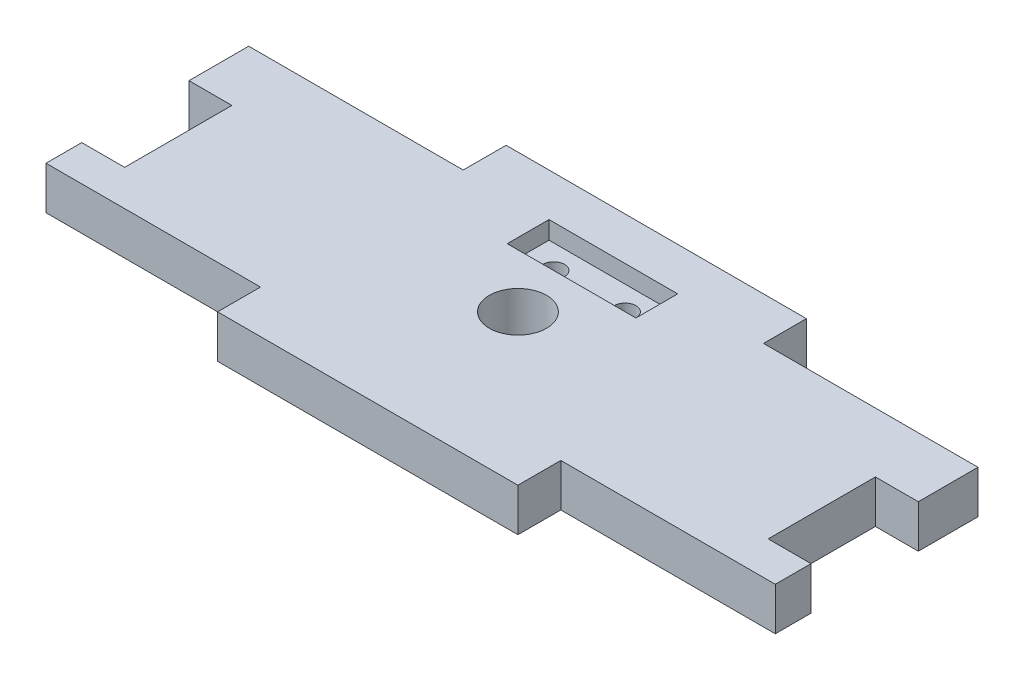
ISO-10303-21;
HEADER;
FILE_DESCRIPTION(('STEP AP214'),'2;1');
FILE_NAME('part.step','',(''),(''),'','','');
FILE_SCHEMA(('AUTOMOTIVE_DESIGN { 1 0 10303 214 1 1 1 1 }'));
ENDSEC;
DATA;
#1=APPLICATION_CONTEXT('core data for automotive mechanical design processes');
#2=APPLICATION_PROTOCOL_DEFINITION('international standard','automotive_design',2000,#1);
#3=PRODUCT_CONTEXT('',#1,'mechanical');
#4=PRODUCT('Part','Part','',(#3));
#5=PRODUCT_RELATED_PRODUCT_CATEGORY('part','',(#4));
#6=PRODUCT_DEFINITION_FORMATION('','',#4);
#7=PRODUCT_DEFINITION_CONTEXT('part definition',#1,'design');
#8=PRODUCT_DEFINITION('design','',#6,#7);
#9=PRODUCT_DEFINITION_SHAPE('','',#8);
#10=(LENGTH_UNIT() NAMED_UNIT(*) SI_UNIT(.MILLI.,.METRE.));
#11=(NAMED_UNIT(*) PLANE_ANGLE_UNIT() SI_UNIT($,.RADIAN.));
#12=(NAMED_UNIT(*) SI_UNIT($,.STERADIAN.) SOLID_ANGLE_UNIT());
#13=UNCERTAINTY_MEASURE_WITH_UNIT(LENGTH_MEASURE(1.E-05),#10,'distance_accuracy_value','');
#14=(GEOMETRIC_REPRESENTATION_CONTEXT(3) GLOBAL_UNCERTAINTY_ASSIGNED_CONTEXT((#13)) GLOBAL_UNIT_ASSIGNED_CONTEXT((#10,
#11,#12)) REPRESENTATION_CONTEXT('',''));
#15=CARTESIAN_POINT('',(0.,0.,0.));
#16=DIRECTION('',(0.,0.,1.));
#17=DIRECTION('',(1.,0.,0.));
#18=AXIS2_PLACEMENT_3D('',#15,#16,#17);
#19=CARTESIAN_POINT('',(-50.001,40.,75.));
#20=DIRECTION('',(0.,1.,0.));
#21=DIRECTION('',(0.,0.,1.));
#22=AXIS2_PLACEMENT_3D('',#19,#20,#21);
#23=PLANE('',#22);
#24=CARTESIAN_POINT('',(4.00000000000001,40.,49.9916660878826));
#25=DIRECTION('',(0.,1.,0.));
#26=DIRECTION('',(0.,0.,1.));
#27=AXIS2_PLACEMENT_3D('',#24,#25,#26);
#28=CIRCLE('',#27,1.5);
#29=CARTESIAN_POINT('',(4.00000000000001,40.,51.4916660878826));
#30=VERTEX_POINT('',#29);
#31=EDGE_CURVE('E375',#30,#30,#28,.T.);
#32=ORIENTED_EDGE('',*,*,#31,.T.);
#33=EDGE_LOOP('',(#32));
#34=FACE_BOUND('',#33,.T.);
#35=CARTESIAN_POINT('',(-5.99999999999999,40.,49.9916660878826));
#36=DIRECTION('',(0.,1.,0.));
#37=DIRECTION('',(0.,0.,1.));
#38=AXIS2_PLACEMENT_3D('',#35,#36,#37);
#39=CIRCLE('',#38,1.5);
#40=CARTESIAN_POINT('',(-5.99999999999999,40.,51.4916660878826));
#41=VERTEX_POINT('',#40);
#42=EDGE_CURVE('E372',#41,#41,#39,.T.);
#43=ORIENTED_EDGE('',*,*,#42,.T.);
#44=EDGE_LOOP('',(#43));
#45=FACE_BOUND('',#44,.T.);
#46=CARTESIAN_POINT('',(-0.999999999999994,40.,59.9916660878826));
#47=DIRECTION('',(0.,1.,0.));
#48=DIRECTION('',(0.,0.,1.));
#49=AXIS2_PLACEMENT_3D('',#46,#47,#48);
#50=CIRCLE('',#49,4.);
#51=CARTESIAN_POINT('',(-0.999999999999994,40.,63.9916660878826));
#52=VERTEX_POINT('',#51);
#53=EDGE_CURVE('E357',#52,#52,#50,.T.);
#54=ORIENTED_EDGE('',*,*,#53,.T.);
#55=EDGE_LOOP('',(#54));
#56=FACE_BOUND('',#55,.T.);
#57=DIRECTION('',(-1.,0.,0.));
#58=VECTOR('',#57,1.);
#59=CARTESIAN_POINT('',(-46.,40.,55.));
#60=LINE('',#59,#58);
#61=CARTESIAN_POINT('',(-46.,40.,55.));
#62=VERTEX_POINT('',#61);
#63=CARTESIAN_POINT('',(-52.,40.,55.));
#64=VERTEX_POINT('',#63);
#65=EDGE_CURVE('E198',#62,#64,#60,.T.);
#66=ORIENTED_EDGE('',*,*,#65,.T.);
#67=DIRECTION('',(0.,0.,1.));
#68=VECTOR('',#67,1.);
#69=CARTESIAN_POINT('',(-52.,40.,70.));
#70=LINE('',#69,#68);
#71=CARTESIAN_POINT('',(-52.,40.,46.65));
#72=VERTEX_POINT('',#71);
#73=EDGE_CURVE('E351',#72,#64,#70,.T.);
#74=ORIENTED_EDGE('',*,*,#73,.F.);
#75=DIRECTION('',(-1.,0.,0.));
#76=VECTOR('',#75,1.);
#77=CARTESIAN_POINT('',(50.,40.,46.65));
#78=LINE('',#77,#76);
#79=CARTESIAN_POINT('',(-22.,40.,46.65));
#80=VERTEX_POINT('',#79);
#81=EDGE_CURVE('E287',#80,#72,#78,.T.);
#82=ORIENTED_EDGE('',*,*,#81,.F.);
#83=DIRECTION('',(0.,0.,1.));
#84=VECTOR('',#83,1.);
#85=CARTESIAN_POINT('',(-22.,40.,40.65));
#86=LINE('',#85,#84);
#87=CARTESIAN_POINT('',(-22.,40.,40.65));
#88=VERTEX_POINT('',#87);
#89=EDGE_CURVE('E279',#88,#80,#86,.T.);
#90=ORIENTED_EDGE('',*,*,#89,.F.);
#91=DIRECTION('',(-1.,0.,0.));
#92=VECTOR('',#91,1.);
#93=CARTESIAN_POINT('',(20.,40.,40.65));
#94=LINE('',#93,#92);
#95=CARTESIAN_POINT('',(20.,40.,40.65));
#96=VERTEX_POINT('',#95);
#97=EDGE_CURVE('E259',#96,#88,#94,.T.);
#98=ORIENTED_EDGE('',*,*,#97,.F.);
#99=DIRECTION('',(0.,0.,1.));
#100=VECTOR('',#99,1.);
#101=CARTESIAN_POINT('',(20.,40.,40.65));
#102=LINE('',#101,#100);
#103=CARTESIAN_POINT('',(20.,40.,46.65));
#104=VERTEX_POINT('',#103);
#105=EDGE_CURVE('E282',#96,#104,#102,.T.);
#106=ORIENTED_EDGE('',*,*,#105,.T.);
#107=CARTESIAN_POINT('',(50.,40.,46.65));
#108=VERTEX_POINT('',#107);
#109=EDGE_CURVE('E288',#108,#104,#78,.T.);
#110=ORIENTED_EDGE('',*,*,#109,.F.);
#111=DIRECTION('',(0.,0.,1.));
#112=VECTOR('',#111,1.);
#113=CARTESIAN_POINT('',(50.,40.,75.));
#114=LINE('',#113,#112);
#115=CARTESIAN_POINT('',(50.,40.,55.));
#116=VERTEX_POINT('',#115);
#117=EDGE_CURVE('E366',#108,#116,#114,.T.);
#118=ORIENTED_EDGE('',*,*,#117,.T.);
#119=DIRECTION('',(1.,0.,0.));
#120=VECTOR('',#119,1.);
#121=CARTESIAN_POINT('',(44.,40.,55.));
#122=LINE('',#121,#120);
#123=CARTESIAN_POINT('',(44.,40.,55.));
#124=VERTEX_POINT('',#123);
#125=EDGE_CURVE('E246',#124,#116,#122,.T.);
#126=ORIENTED_EDGE('',*,*,#125,.F.);
#127=DIRECTION('',(0.,0.,-1.));
#128=VECTOR('',#127,1.);
#129=CARTESIAN_POINT('',(44.,40.,55.));
#130=LINE('',#129,#128);
#131=CARTESIAN_POINT('',(44.,40.,70.));
#132=VERTEX_POINT('',#131);
#133=EDGE_CURVE('E241',#132,#124,#130,.T.);
#134=ORIENTED_EDGE('',*,*,#133,.F.);
#135=DIRECTION('',(1.,0.,0.));
#136=VECTOR('',#135,1.);
#137=CARTESIAN_POINT('',(44.,40.,70.));
#138=LINE('',#137,#136);
#139=CARTESIAN_POINT('',(50.,40.,70.));
#140=VERTEX_POINT('',#139);
#141=EDGE_CURVE('E249',#132,#140,#138,.T.);
#142=ORIENTED_EDGE('',*,*,#141,.T.);
#143=CARTESIAN_POINT('',(50.,40.,75.));
#144=VERTEX_POINT('',#143);
#145=EDGE_CURVE('E369',#140,#144,#114,.T.);
#146=ORIENTED_EDGE('',*,*,#145,.T.);
#147=DIRECTION('',(1.,0.,0.));
#148=VECTOR('',#147,1.);
#149=CARTESIAN_POINT('',(20.,40.,75.));
#150=LINE('',#149,#148);
#151=CARTESIAN_POINT('',(20.,40.,75.));
#152=VERTEX_POINT('',#151);
#153=EDGE_CURVE('E307',#152,#144,#150,.T.);
#154=ORIENTED_EDGE('',*,*,#153,.F.);
#155=DIRECTION('',(0.,0.,1.));
#156=VECTOR('',#155,1.);
#157=CARTESIAN_POINT('',(20.,40.,75.));
#158=LINE('',#157,#156);
#159=CARTESIAN_POINT('',(20.,40.,81.));
#160=VERTEX_POINT('',#159);
#161=EDGE_CURVE('E316',#152,#160,#158,.T.);
#162=ORIENTED_EDGE('',*,*,#161,.T.);
#163=DIRECTION('',(1.,0.,0.));
#164=VECTOR('',#163,1.);
#165=CARTESIAN_POINT('',(-52.,40.,81.));
#166=LINE('',#165,#164);
#167=CARTESIAN_POINT('',(-22.,40.,81.));
#168=VERTEX_POINT('',#167);
#169=EDGE_CURVE('E340',#168,#160,#166,.T.);
#170=ORIENTED_EDGE('',*,*,#169,.F.);
#171=DIRECTION('',(0.,0.,1.));
#172=VECTOR('',#171,1.);
#173=CARTESIAN_POINT('',(-22.,40.,75.));
#174=LINE('',#173,#172);
#175=CARTESIAN_POINT('',(-22.,40.,75.));
#176=VERTEX_POINT('',#175);
#177=EDGE_CURVE('E334',#176,#168,#174,.T.);
#178=ORIENTED_EDGE('',*,*,#177,.F.);
#179=DIRECTION('',(1.,0.,0.));
#180=VECTOR('',#179,1.);
#181=CARTESIAN_POINT('',(-52.,40.,75.));
#182=LINE('',#181,#180);
#183=CARTESIAN_POINT('',(-52.,40.,75.));
#184=VERTEX_POINT('',#183);
#185=EDGE_CURVE('E326',#184,#176,#182,.T.);
#186=ORIENTED_EDGE('',*,*,#185,.F.);
#187=CARTESIAN_POINT('',(-52.,40.,70.));
#188=VERTEX_POINT('',#187);
#189=EDGE_CURVE('E350',#188,#184,#70,.T.);
#190=ORIENTED_EDGE('',*,*,#189,.F.);
#191=DIRECTION('',(-1.,0.,0.));
#192=VECTOR('',#191,1.);
#193=CARTESIAN_POINT('',(-46.,40.,70.));
#194=LINE('',#193,#192);
#195=CARTESIAN_POINT('',(-46.,40.,70.));
#196=VERTEX_POINT('',#195);
#197=EDGE_CURVE('E52',#196,#188,#194,.T.);
#198=ORIENTED_EDGE('',*,*,#197,.F.);
#199=DIRECTION('',(0.,0.,-1.));
#200=VECTOR('',#199,1.);
#201=CARTESIAN_POINT('',(-46.,40.,55.));
#202=LINE('',#201,#200);
#203=EDGE_CURVE('E215',#196,#62,#202,.T.);
#204=ORIENTED_EDGE('',*,*,#203,.T.);
#205=EDGE_LOOP('',(#66,#74,#82,#90,#98,#106,#110,#118,#126,#134,#142,#146,#154,#162,#170,#178,
#186,#190,#198,#204));
#206=FACE_BOUND('',#205,.T.);
#207=ADVANCED_FACE('F35',(#34,#45,#56,#206),#23,.F.);
#208=CARTESIAN_POINT('',(-50.001,46.,75.));
#209=DIRECTION('',(0.,1.,0.));
#210=DIRECTION('',(0.,0.,1.));
#211=AXIS2_PLACEMENT_3D('',#208,#209,#210);
#212=PLANE('',#211);
#213=DIRECTION('',(1.,0.,0.));
#214=VECTOR('',#213,1.);
#215=CARTESIAN_POINT('',(20.,46.,46.65));
#216=LINE('',#215,#214);
#217=CARTESIAN_POINT('',(-9.99999999999999,46.,46.65));
#218=VERTEX_POINT('',#217);
#219=CARTESIAN_POINT('',(8.00000000000001,46.,46.65));
#220=VERTEX_POINT('',#219);
#221=EDGE_CURVE('E260',#218,#220,#216,.T.);
#222=ORIENTED_EDGE('',*,*,#221,.T.);
#223=DIRECTION('',(0.,0.,-1.));
#224=VECTOR('',#223,1.);
#225=CARTESIAN_POINT('',(8.00000000000001,46.,52.4916660878826));
#226=LINE('',#225,#224);
#227=CARTESIAN_POINT('',(8.00000000000001,46.,52.4916660878826));
#228=VERTEX_POINT('',#227);
#229=EDGE_CURVE('E380',#228,#220,#226,.T.);
#230=ORIENTED_EDGE('',*,*,#229,.F.);
#231=DIRECTION('',(1.,0.,0.));
#232=VECTOR('',#231,1.);
#233=CARTESIAN_POINT('',(8.00000000000001,46.,52.4916660878826));
#234=LINE('',#233,#232);
#235=CARTESIAN_POINT('',(-9.99999999999999,46.,52.4916660878826));
#236=VERTEX_POINT('',#235);
#237=EDGE_CURVE('E383',#236,#228,#234,.T.);
#238=ORIENTED_EDGE('',*,*,#237,.F.);
#239=DIRECTION('',(0.,0.,1.));
#240=VECTOR('',#239,1.);
#241=CARTESIAN_POINT('',(-9.99999999999999,46.,52.4916660878826));
#242=LINE('',#241,#240);
#243=EDGE_CURVE('E11',#218,#236,#242,.T.);
#244=ORIENTED_EDGE('',*,*,#243,.F.);
#245=EDGE_LOOP('',(#222,#230,#238,#244));
#246=FACE_BOUND('',#245,.T.);
#247=CARTESIAN_POINT('',(-0.999999999999994,46.,59.9916660878826));
#248=DIRECTION('',(0.,1.,0.));
#249=DIRECTION('',(0.,0.,1.));
#250=AXIS2_PLACEMENT_3D('',#247,#248,#249);
#251=CIRCLE('',#250,4.);
#252=CARTESIAN_POINT('',(-0.999999999999994,46.,63.9916660878826));
#253=VERTEX_POINT('',#252);
#254=EDGE_CURVE('E362',#253,#253,#251,.T.);
#255=ORIENTED_EDGE('',*,*,#254,.F.);
#256=EDGE_LOOP('',(#255));
#257=FACE_BOUND('',#256,.T.);
#258=DIRECTION('',(0.,0.,-1.));
#259=VECTOR('',#258,1.);
#260=CARTESIAN_POINT('',(-52.,46.,70.));
#261=LINE('',#260,#259);
#262=CARTESIAN_POINT('',(-52.,46.,55.));
#263=VERTEX_POINT('',#262);
#264=CARTESIAN_POINT('',(-52.,46.,46.65));
#265=VERTEX_POINT('',#264);
#266=EDGE_CURVE('E346',#263,#265,#261,.T.);
#267=ORIENTED_EDGE('',*,*,#266,.F.);
#268=DIRECTION('',(-1.,0.,0.));
#269=VECTOR('',#268,1.);
#270=CARTESIAN_POINT('',(-46.,46.,55.));
#271=LINE('',#270,#269);
#272=CARTESIAN_POINT('',(-46.,46.,55.));
#273=VERTEX_POINT('',#272);
#274=EDGE_CURVE('E227',#273,#263,#271,.T.);
#275=ORIENTED_EDGE('',*,*,#274,.F.);
#276=DIRECTION('',(0.,0.,1.));
#277=VECTOR('',#276,1.);
#278=CARTESIAN_POINT('',(-46.,46.,55.));
#279=LINE('',#278,#277);
#280=CARTESIAN_POINT('',(-46.,46.,70.));
#281=VERTEX_POINT('',#280);
#282=EDGE_CURVE('E209',#273,#281,#279,.T.);
#283=ORIENTED_EDGE('',*,*,#282,.T.);
#284=DIRECTION('',(-1.,0.,0.));
#285=VECTOR('',#284,1.);
#286=CARTESIAN_POINT('',(-46.,46.,70.));
#287=LINE('',#286,#285);
#288=CARTESIAN_POINT('',(-52.,46.,70.));
#289=VERTEX_POINT('',#288);
#290=EDGE_CURVE('E230',#281,#289,#287,.T.);
#291=ORIENTED_EDGE('',*,*,#290,.T.);
#292=CARTESIAN_POINT('',(-52.,46.,75.));
#293=VERTEX_POINT('',#292);
#294=EDGE_CURVE('E347',#293,#289,#261,.T.);
#295=ORIENTED_EDGE('',*,*,#294,.F.);
#296=DIRECTION('',(-1.,0.,0.));
#297=VECTOR('',#296,1.);
#298=CARTESIAN_POINT('',(-52.,46.,75.));
#299=LINE('',#298,#297);
#300=CARTESIAN_POINT('',(-22.,46.,75.));
#301=VERTEX_POINT('',#300);
#302=EDGE_CURVE('E332',#301,#293,#299,.T.);
#303=ORIENTED_EDGE('',*,*,#302,.F.);
#304=DIRECTION('',(0.,0.,1.));
#305=VECTOR('',#304,1.);
#306=CARTESIAN_POINT('',(-22.,46.,75.));
#307=LINE('',#306,#305);
#308=CARTESIAN_POINT('',(-22.,46.,81.));
#309=VERTEX_POINT('',#308);
#310=EDGE_CURVE('E337',#301,#309,#307,.T.);
#311=ORIENTED_EDGE('',*,*,#310,.T.);
#312=DIRECTION('',(-1.,0.,0.));
#313=VECTOR('',#312,1.);
#314=CARTESIAN_POINT('',(-52.,46.,81.));
#315=LINE('',#314,#313);
#316=CARTESIAN_POINT('',(20.,46.,81.));
#317=VERTEX_POINT('',#316);
#318=EDGE_CURVE('E344',#317,#309,#315,.T.);
#319=ORIENTED_EDGE('',*,*,#318,.F.);
#320=DIRECTION('',(0.,0.,1.));
#321=VECTOR('',#320,1.);
#322=CARTESIAN_POINT('',(20.,46.,75.));
#323=LINE('',#322,#321);
#324=CARTESIAN_POINT('',(20.,46.,75.));
#325=VERTEX_POINT('',#324);
#326=EDGE_CURVE('E318',#325,#317,#323,.T.);
#327=ORIENTED_EDGE('',*,*,#326,.F.);
#328=DIRECTION('',(-1.,0.,0.));
#329=VECTOR('',#328,1.);
#330=CARTESIAN_POINT('',(20.,46.,75.));
#331=LINE('',#330,#329);
#332=CARTESIAN_POINT('',(50.,46.,75.));
#333=VERTEX_POINT('',#332);
#334=EDGE_CURVE('E313',#333,#325,#331,.T.);
#335=ORIENTED_EDGE('',*,*,#334,.F.);
#336=DIRECTION('',(0.,0.,1.));
#337=VECTOR('',#336,1.);
#338=CARTESIAN_POINT('',(50.,46.,45.));
#339=LINE('',#338,#337);
#340=CARTESIAN_POINT('',(50.,46.,70.));
#341=VERTEX_POINT('',#340);
#342=EDGE_CURVE('E353',#341,#333,#339,.T.);
#343=ORIENTED_EDGE('',*,*,#342,.F.);
#344=DIRECTION('',(1.,0.,0.));
#345=VECTOR('',#344,1.);
#346=CARTESIAN_POINT('',(44.,46.,70.));
#347=LINE('',#346,#345);
#348=CARTESIAN_POINT('',(44.,46.,70.));
#349=VERTEX_POINT('',#348);
#350=EDGE_CURVE('E252',#349,#341,#347,.T.);
#351=ORIENTED_EDGE('',*,*,#350,.F.);
#352=DIRECTION('',(0.,0.,1.));
#353=VECTOR('',#352,1.);
#354=CARTESIAN_POINT('',(44.,46.,55.));
#355=LINE('',#354,#353);
#356=CARTESIAN_POINT('',(44.,46.,55.));
#357=VERTEX_POINT('',#356);
#358=EDGE_CURVE('E235',#357,#349,#355,.T.);
#359=ORIENTED_EDGE('',*,*,#358,.F.);
#360=DIRECTION('',(1.,0.,0.));
#361=VECTOR('',#360,1.);
#362=CARTESIAN_POINT('',(44.,46.,55.));
#363=LINE('',#362,#361);
#364=CARTESIAN_POINT('',(50.,46.,55.));
#365=VERTEX_POINT('',#364);
#366=EDGE_CURVE('E243',#357,#365,#363,.T.);
#367=ORIENTED_EDGE('',*,*,#366,.T.);
#368=CARTESIAN_POINT('',(50.,46.,46.65));
#369=VERTEX_POINT('',#368);
#370=EDGE_CURVE('E354',#369,#365,#339,.T.);
#371=ORIENTED_EDGE('',*,*,#370,.F.);
#372=DIRECTION('',(1.,0.,0.));
#373=VECTOR('',#372,1.);
#374=CARTESIAN_POINT('',(50.,46.,46.65));
#375=LINE('',#374,#373);
#376=CARTESIAN_POINT('',(20.,46.,46.65));
#377=VERTEX_POINT('',#376);
#378=EDGE_CURVE('E293',#377,#369,#375,.T.);
#379=ORIENTED_EDGE('',*,*,#378,.F.);
#380=DIRECTION('',(0.,0.,1.));
#381=VECTOR('',#380,1.);
#382=CARTESIAN_POINT('',(20.,46.,40.65));
#383=LINE('',#382,#381);
#384=CARTESIAN_POINT('',(20.,46.,40.65));
#385=VERTEX_POINT('',#384);
#386=EDGE_CURVE('E266',#385,#377,#383,.T.);
#387=ORIENTED_EDGE('',*,*,#386,.F.);
#388=DIRECTION('',(1.,0.,0.));
#389=VECTOR('',#388,1.);
#390=CARTESIAN_POINT('',(20.,46.,40.65));
#391=LINE('',#390,#389);
#392=CARTESIAN_POINT('',(-22.,46.,40.65));
#393=VERTEX_POINT('',#392);
#394=EDGE_CURVE('E264',#393,#385,#391,.T.);
#395=ORIENTED_EDGE('',*,*,#394,.F.);
#396=DIRECTION('',(0.,0.,1.));
#397=VECTOR('',#396,1.);
#398=CARTESIAN_POINT('',(-22.,46.,40.65));
#399=LINE('',#398,#397);
#400=CARTESIAN_POINT('',(-22.,46.,46.65));
#401=VERTEX_POINT('',#400);
#402=EDGE_CURVE('E276',#393,#401,#399,.T.);
#403=ORIENTED_EDGE('',*,*,#402,.T.);
#404=EDGE_CURVE('E294',#265,#401,#375,.T.);
#405=ORIENTED_EDGE('',*,*,#404,.F.);
#406=EDGE_LOOP('',(#267,#275,#283,#291,#295,#303,#311,#319,#327,#335,#343,#351,#359,#367,#371,
#379,#387,#395,#403,#405));
#407=FACE_BOUND('',#406,.T.);
#408=ADVANCED_FACE('F413',(#246,#257,#407),#212,.T.);
#409=CARTESIAN_POINT('',(-52.,0.,0.));
#410=DIRECTION('',(1.,0.,0.));
#411=DIRECTION('',(0.,0.,-1.));
#412=AXIS2_PLACEMENT_3D('',#409,#410,#411);
#413=PLANE('',#412);
#414=DIRECTION('',(0.,1.,0.));
#415=VECTOR('',#414,1.);
#416=CARTESIAN_POINT('',(-52.,46.,55.));
#417=LINE('',#416,#415);
#418=EDGE_CURVE('E204',#64,#263,#417,.T.);
#419=ORIENTED_EDGE('',*,*,#418,.T.);
#420=ORIENTED_EDGE('',*,*,#266,.T.);
#421=DIRECTION('',(0.,1.,0.));
#422=VECTOR('',#421,1.);
#423=CARTESIAN_POINT('',(-52.,40.,46.65));
#424=LINE('',#423,#422);
#425=EDGE_CURVE('E290',#72,#265,#424,.T.);
#426=ORIENTED_EDGE('',*,*,#425,.F.);
#427=ORIENTED_EDGE('',*,*,#73,.T.);
#428=EDGE_LOOP('',(#419,#420,#426,#427));
#429=FACE_BOUND('',#428,.T.);
#430=ADVANCED_FACE('F416',(#429),#413,.F.);
#431=DIRECTION('',(0.,-1.,0.));
#432=VECTOR('',#431,1.);
#433=CARTESIAN_POINT('',(-52.,46.,70.));
#434=LINE('',#433,#432);
#435=EDGE_CURVE('E217',#289,#188,#434,.T.);
#436=ORIENTED_EDGE('',*,*,#435,.T.);
#437=ORIENTED_EDGE('',*,*,#189,.T.);
#438=DIRECTION('',(0.,-1.,0.));
#439=VECTOR('',#438,1.);
#440=CARTESIAN_POINT('',(-52.,40.,75.));
#441=LINE('',#440,#439);
#442=EDGE_CURVE('E323',#293,#184,#441,.T.);
#443=ORIENTED_EDGE('',*,*,#442,.F.);
#444=ORIENTED_EDGE('',*,*,#294,.T.);
#445=EDGE_LOOP('',(#436,#437,#443,#444));
#446=FACE_BOUND('',#445,.T.);
#447=ADVANCED_FACE('F488',(#446),#413,.F.);
#448=CARTESIAN_POINT('',(50.,150.,75.));
#449=DIRECTION('',(-1.,0.,0.));
#450=DIRECTION('',(0.,0.,1.));
#451=AXIS2_PLACEMENT_3D('',#448,#449,#450);
#452=PLANE('',#451);
#453=ORIENTED_EDGE('',*,*,#370,.T.);
#454=DIRECTION('',(0.,1.,0.));
#455=VECTOR('',#454,1.);
#456=CARTESIAN_POINT('',(50.,46.,55.));
#457=LINE('',#456,#455);
#458=EDGE_CURVE('E229',#116,#365,#457,.T.);
#459=ORIENTED_EDGE('',*,*,#458,.F.);
#460=ORIENTED_EDGE('',*,*,#117,.F.);
#461=DIRECTION('',(0.,-1.,0.));
#462=VECTOR('',#461,1.);
#463=CARTESIAN_POINT('',(50.,40.,46.65));
#464=LINE('',#463,#462);
#465=EDGE_CURVE('E285',#369,#108,#464,.T.);
#466=ORIENTED_EDGE('',*,*,#465,.F.);
#467=EDGE_LOOP('',(#453,#459,#460,#466));
#468=FACE_BOUND('',#467,.T.);
#469=ADVANCED_FACE('F450',(#468),#452,.F.);
#470=CARTESIAN_POINT('',(0.,0.,46.65));
#471=DIRECTION('',(0.,0.,1.));
#472=DIRECTION('',(1.,0.,0.));
#473=AXIS2_PLACEMENT_3D('',#470,#471,#472);
#474=PLANE('',#473);
#475=DIRECTION('',(0.,-1.,0.));
#476=VECTOR('',#475,1.);
#477=CARTESIAN_POINT('',(20.,40.,46.65));
#478=LINE('',#477,#476);
#479=EDGE_CURVE('E248',#377,#104,#478,.T.);
#480=ORIENTED_EDGE('',*,*,#479,.F.);
#481=ORIENTED_EDGE('',*,*,#378,.T.);
#482=ORIENTED_EDGE('',*,*,#465,.T.);
#483=ORIENTED_EDGE('',*,*,#109,.T.);
#484=EDGE_LOOP('',(#480,#481,#482,#483));
#485=FACE_BOUND('',#484,.T.);
#486=ADVANCED_FACE('F444',(#485),#474,.F.);
#487=DIRECTION('',(0.,1.,0.));
#488=VECTOR('',#487,1.);
#489=CARTESIAN_POINT('',(-22.,40.,46.65));
#490=LINE('',#489,#488);
#491=EDGE_CURVE('E269',#80,#401,#490,.T.);
#492=ORIENTED_EDGE('',*,*,#491,.F.);
#493=ORIENTED_EDGE('',*,*,#81,.T.);
#494=ORIENTED_EDGE('',*,*,#425,.T.);
#495=ORIENTED_EDGE('',*,*,#404,.T.);
#496=EDGE_LOOP('',(#492,#493,#494,#495));
#497=FACE_BOUND('',#496,.T.);
#498=ADVANCED_FACE('F425',(#497),#474,.F.);
#499=CARTESIAN_POINT('',(4.00000000000001,150.,49.9916660878826));
#500=DIRECTION('',(0.,-1.,0.));
#501=DIRECTION('',(0.,0.,-1.));
#502=AXIS2_PLACEMENT_3D('',#499,#500,#501);
#503=CYLINDRICAL_SURFACE('',#502,1.5);
#504=ORIENTED_EDGE('',*,*,#31,.F.);
#505=EDGE_LOOP('',(#504));
#506=FACE_BOUND('',#505,.T.);
#507=CARTESIAN_POINT('',(4.00000000000001,43.5,49.9916660878826));
#508=DIRECTION('',(0.,1.,0.));
#509=DIRECTION('',(0.,0.,1.));
#510=AXIS2_PLACEMENT_3D('',#507,#508,#509);
#511=CIRCLE('',#510,1.5);
#512=CARTESIAN_POINT('',(4.00000000000001,43.5,51.4916660878826));
#513=VERTEX_POINT('',#512);
#514=EDGE_CURVE('E361',#513,#513,#511,.F.);
#515=ORIENTED_EDGE('',*,*,#514,.F.);
#516=EDGE_LOOP('',(#515));
#517=FACE_BOUND('',#516,.T.);
#518=ADVANCED_FACE('F507',(#506,#517),#503,.F.);
#519=CARTESIAN_POINT('',(-5.99999999999999,150.,49.9916660878826));
#520=DIRECTION('',(0.,-1.,0.));
#521=DIRECTION('',(0.,0.,-1.));
#522=AXIS2_PLACEMENT_3D('',#519,#520,#521);
#523=CYLINDRICAL_SURFACE('',#522,1.5);
#524=ORIENTED_EDGE('',*,*,#42,.F.);
#525=EDGE_LOOP('',(#524));
#526=FACE_BOUND('',#525,.T.);
#527=CARTESIAN_POINT('',(-5.99999999999999,43.5,49.9916660878826));
#528=DIRECTION('',(0.,1.,0.));
#529=DIRECTION('',(0.,0.,1.));
#530=AXIS2_PLACEMENT_3D('',#527,#528,#529);
#531=CIRCLE('',#530,1.5);
#532=CARTESIAN_POINT('',(-5.99999999999999,43.5,51.4916660878826));
#533=VERTEX_POINT('',#532);
#534=EDGE_CURVE('E358',#533,#533,#531,.F.);
#535=ORIENTED_EDGE('',*,*,#534,.F.);
#536=EDGE_LOOP('',(#535));
#537=FACE_BOUND('',#536,.T.);
#538=ADVANCED_FACE('F510',(#526,#537),#523,.F.);
#539=ORIENTED_EDGE('',*,*,#145,.F.);
#540=DIRECTION('',(0.,-1.,0.));
#541=VECTOR('',#540,1.);
#542=CARTESIAN_POINT('',(50.,46.,70.));
#543=LINE('',#542,#541);
#544=EDGE_CURVE('E236',#341,#140,#543,.T.);
#545=ORIENTED_EDGE('',*,*,#544,.F.);
#546=ORIENTED_EDGE('',*,*,#342,.T.);
#547=DIRECTION('',(0.,1.,0.));
#548=VECTOR('',#547,1.);
#549=CARTESIAN_POINT('',(50.,40.,75.));
#550=LINE('',#549,#548);
#551=EDGE_CURVE('E310',#144,#333,#550,.T.);
#552=ORIENTED_EDGE('',*,*,#551,.F.);
#553=EDGE_LOOP('',(#539,#545,#546,#552));
#554=FACE_BOUND('',#553,.T.);
#555=ADVANCED_FACE('F464',(#554),#452,.F.);
#556=CARTESIAN_POINT('',(-0.999999999999994,150.,59.9916660878826));
#557=DIRECTION('',(0.,-1.,0.));
#558=DIRECTION('',(0.,0.,-1.));
#559=AXIS2_PLACEMENT_3D('',#556,#557,#558);
#560=CYLINDRICAL_SURFACE('',#559,4.);
#561=ORIENTED_EDGE('',*,*,#254,.T.);
#562=EDGE_LOOP('',(#561));
#563=FACE_BOUND('',#562,.T.);
#564=ORIENTED_EDGE('',*,*,#53,.F.);
#565=EDGE_LOOP('',(#564));
#566=FACE_BOUND('',#565,.T.);
#567=ADVANCED_FACE('F515',(#563,#566),#560,.F.);
#568=CARTESIAN_POINT('',(0.,43.5,0.));
#569=DIRECTION('',(0.,1.,0.));
#570=DIRECTION('',(0.,0.,1.));
#571=AXIS2_PLACEMENT_3D('',#568,#569,#570);
#572=PLANE('',#571);
#573=DIRECTION('',(1.,0.,0.));
#574=VECTOR('',#573,1.);
#575=CARTESIAN_POINT('',(0.,43.5,46.65));
#576=LINE('',#575,#574);
#577=CARTESIAN_POINT('',(-9.99999999999999,43.5,46.65));
#578=VERTEX_POINT('',#577);
#579=CARTESIAN_POINT('',(8.00000000000001,43.5,46.65));
#580=VERTEX_POINT('',#579);
#581=EDGE_CURVE('E298',#578,#580,#576,.T.);
#582=ORIENTED_EDGE('',*,*,#581,.F.);
#583=DIRECTION('',(0.,0.,1.));
#584=VECTOR('',#583,1.);
#585=CARTESIAN_POINT('',(-9.99999999999999,43.5,52.4916660878826));
#586=LINE('',#585,#584);
#587=CARTESIAN_POINT('',(-9.99999999999999,43.5,52.4916660878826));
#588=VERTEX_POINT('',#587);
#589=EDGE_CURVE('E365',#578,#588,#586,.T.);
#590=ORIENTED_EDGE('',*,*,#589,.T.);
#591=DIRECTION('',(1.,0.,0.));
#592=VECTOR('',#591,1.);
#593=CARTESIAN_POINT('',(8.00000000000001,43.5,52.4916660878826));
#594=LINE('',#593,#592);
#595=CARTESIAN_POINT('',(8.00000000000001,43.5,52.4916660878826));
#596=VERTEX_POINT('',#595);
#597=EDGE_CURVE('E389',#588,#596,#594,.T.);
#598=ORIENTED_EDGE('',*,*,#597,.T.);
#599=DIRECTION('',(0.,0.,-1.));
#600=VECTOR('',#599,1.);
#601=CARTESIAN_POINT('',(8.00000000000001,43.5,52.4916660878826));
#602=LINE('',#601,#600);
#603=EDGE_CURVE('E39',#596,#580,#602,.T.);
#604=ORIENTED_EDGE('',*,*,#603,.T.);
#605=EDGE_LOOP('',(#582,#590,#598,#604));
#606=FACE_BOUND('',#605,.T.);
#607=ORIENTED_EDGE('',*,*,#534,.T.);
#608=EDGE_LOOP('',(#607));
#609=FACE_BOUND('',#608,.T.);
#610=ORIENTED_EDGE('',*,*,#514,.T.);
#611=EDGE_LOOP('',(#610));
#612=FACE_BOUND('',#611,.T.);
#613=ADVANCED_FACE('F37',(#606,#609,#612),#572,.T.);
#614=CARTESIAN_POINT('',(8.00000000000001,43.5,52.4916660878826));
#615=DIRECTION('',(1.,0.,0.));
#616=DIRECTION('',(0.,0.,-1.));
#617=AXIS2_PLACEMENT_3D('',#614,#615,#616);
#618=PLANE('',#617);
#619=ORIENTED_EDGE('',*,*,#229,.T.);
#620=DIRECTION('',(0.,-1.,0.));
#621=VECTOR('',#620,1.);
#622=CARTESIAN_POINT('',(8.00000000000001,43.5,46.65));
#623=LINE('',#622,#621);
#624=EDGE_CURVE('E301',#220,#580,#623,.T.);
#625=ORIENTED_EDGE('',*,*,#624,.T.);
#626=ORIENTED_EDGE('',*,*,#603,.F.);
#627=DIRECTION('',(0.,1.,0.));
#628=VECTOR('',#627,1.);
#629=CARTESIAN_POINT('',(8.00000000000001,43.5,52.4916660878826));
#630=LINE('',#629,#628);
#631=EDGE_CURVE('E384',#596,#228,#630,.T.);
#632=ORIENTED_EDGE('',*,*,#631,.T.);
#633=EDGE_LOOP('',(#619,#625,#626,#632));
#634=FACE_BOUND('',#633,.T.);
#635=ADVANCED_FACE('F407',(#634),#618,.F.);
#636=CARTESIAN_POINT('',(8.00000000000001,43.5,52.4916660878826));
#637=DIRECTION('',(0.,0.,1.));
#638=DIRECTION('',(1.,0.,0.));
#639=AXIS2_PLACEMENT_3D('',#636,#637,#638);
#640=PLANE('',#639);
#641=ORIENTED_EDGE('',*,*,#237,.T.);
#642=ORIENTED_EDGE('',*,*,#631,.F.);
#643=ORIENTED_EDGE('',*,*,#597,.F.);
#644=DIRECTION('',(0.,1.,0.));
#645=VECTOR('',#644,1.);
#646=CARTESIAN_POINT('',(-9.99999999999999,43.5,52.4916660878826));
#647=LINE('',#646,#645);
#648=EDGE_CURVE('E44',#588,#236,#647,.T.);
#649=ORIENTED_EDGE('',*,*,#648,.T.);
#650=EDGE_LOOP('',(#641,#642,#643,#649));
#651=FACE_BOUND('',#650,.T.);
#652=ADVANCED_FACE('F403',(#651),#640,.F.);
#653=CARTESIAN_POINT('',(-9.99999999999999,43.5,52.4916660878826));
#654=DIRECTION('',(-1.,0.,0.));
#655=DIRECTION('',(0.,0.,1.));
#656=AXIS2_PLACEMENT_3D('',#653,#654,#655);
#657=PLANE('',#656);
#658=ORIENTED_EDGE('',*,*,#589,.F.);
#659=DIRECTION('',(0.,1.,0.));
#660=VECTOR('',#659,1.);
#661=CARTESIAN_POINT('',(-9.99999999999999,43.5,46.65));
#662=LINE('',#661,#660);
#663=EDGE_CURVE('E296',#578,#218,#662,.T.);
#664=ORIENTED_EDGE('',*,*,#663,.T.);
#665=ORIENTED_EDGE('',*,*,#243,.T.);
#666=ORIENTED_EDGE('',*,*,#648,.F.);
#667=EDGE_LOOP('',(#658,#664,#665,#666));
#668=FACE_BOUND('',#667,.T.);
#669=ADVANCED_FACE('F399',(#668),#657,.F.);
#670=CARTESIAN_POINT('',(0.,0.,81.));
#671=DIRECTION('',(0.,0.,1.));
#672=DIRECTION('',(1.,0.,0.));
#673=AXIS2_PLACEMENT_3D('',#670,#671,#672);
#674=PLANE('',#673);
#675=DIRECTION('',(0.,-1.,0.));
#676=VECTOR('',#675,1.);
#677=CARTESIAN_POINT('',(20.,40.,81.));
#678=LINE('',#677,#676);
#679=EDGE_CURVE('E303',#317,#160,#678,.T.);
#680=ORIENTED_EDGE('',*,*,#679,.F.);
#681=ORIENTED_EDGE('',*,*,#318,.T.);
#682=DIRECTION('',(0.,1.,0.));
#683=VECTOR('',#682,1.);
#684=CARTESIAN_POINT('',(-22.,40.,81.));
#685=LINE('',#684,#683);
#686=EDGE_CURVE('E320',#168,#309,#685,.T.);
#687=ORIENTED_EDGE('',*,*,#686,.F.);
#688=ORIENTED_EDGE('',*,*,#169,.T.);
#689=EDGE_LOOP('',(#680,#681,#687,#688));
#690=FACE_BOUND('',#689,.T.);
#691=ADVANCED_FACE('F475',(#690),#674,.T.);
#692=CARTESIAN_POINT('',(-22.,40.,75.));
#693=DIRECTION('',(1.,0.,0.));
#694=DIRECTION('',(0.,0.,-1.));
#695=AXIS2_PLACEMENT_3D('',#692,#693,#694);
#696=PLANE('',#695);
#697=ORIENTED_EDGE('',*,*,#686,.T.);
#698=ORIENTED_EDGE('',*,*,#310,.F.);
#699=DIRECTION('',(0.,1.,0.));
#700=VECTOR('',#699,1.);
#701=CARTESIAN_POINT('',(-22.,40.,75.));
#702=LINE('',#701,#700);
#703=EDGE_CURVE('E329',#176,#301,#702,.T.);
#704=ORIENTED_EDGE('',*,*,#703,.F.);
#705=ORIENTED_EDGE('',*,*,#177,.T.);
#706=EDGE_LOOP('',(#697,#698,#704,#705));
#707=FACE_BOUND('',#706,.T.);
#708=ADVANCED_FACE('F481',(#707),#696,.F.);
#709=CARTESIAN_POINT('',(0.,0.,75.));
#710=DIRECTION('',(0.,0.,-1.));
#711=DIRECTION('',(-1.,0.,0.));
#712=AXIS2_PLACEMENT_3D('',#709,#710,#711);
#713=PLANE('',#712);
#714=ORIENTED_EDGE('',*,*,#442,.T.);
#715=ORIENTED_EDGE('',*,*,#185,.T.);
#716=ORIENTED_EDGE('',*,*,#703,.T.);
#717=ORIENTED_EDGE('',*,*,#302,.T.);
#718=EDGE_LOOP('',(#714,#715,#716,#717));
#719=FACE_BOUND('',#718,.T.);
#720=ADVANCED_FACE('F484',(#719),#713,.F.);
#721=CARTESIAN_POINT('',(20.,40.,75.));
#722=DIRECTION('',(-1.,0.,0.));
#723=DIRECTION('',(0.,0.,1.));
#724=AXIS2_PLACEMENT_3D('',#721,#722,#723);
#725=PLANE('',#724);
#726=ORIENTED_EDGE('',*,*,#679,.T.);
#727=ORIENTED_EDGE('',*,*,#161,.F.);
#728=DIRECTION('',(0.,-1.,0.));
#729=VECTOR('',#728,1.);
#730=CARTESIAN_POINT('',(20.,40.,75.));
#731=LINE('',#730,#729);
#732=EDGE_CURVE('E304',#325,#152,#731,.T.);
#733=ORIENTED_EDGE('',*,*,#732,.F.);
#734=ORIENTED_EDGE('',*,*,#326,.T.);
#735=EDGE_LOOP('',(#726,#727,#733,#734));
#736=FACE_BOUND('',#735,.T.);
#737=ADVANCED_FACE('F473',(#736),#725,.F.);
#738=CARTESIAN_POINT('',(72.,0.,75.));
#739=DIRECTION('',(0.,0.,-1.));
#740=DIRECTION('',(-1.,0.,0.));
#741=AXIS2_PLACEMENT_3D('',#738,#739,#740);
#742=PLANE('',#741);
#743=ORIENTED_EDGE('',*,*,#732,.T.);
#744=ORIENTED_EDGE('',*,*,#153,.T.);
#745=ORIENTED_EDGE('',*,*,#551,.T.);
#746=ORIENTED_EDGE('',*,*,#334,.T.);
#747=EDGE_LOOP('',(#743,#744,#745,#746));
#748=FACE_BOUND('',#747,.T.);
#749=ADVANCED_FACE('F468',(#748),#742,.F.);
#750=CARTESIAN_POINT('',(0.,0.,46.65));
#751=DIRECTION('',(0.,0.,1.));
#752=DIRECTION('',(1.,0.,0.));
#753=AXIS2_PLACEMENT_3D('',#750,#751,#752);
#754=PLANE('',#753);
#755=ORIENTED_EDGE('',*,*,#663,.F.);
#756=ORIENTED_EDGE('',*,*,#581,.T.);
#757=ORIENTED_EDGE('',*,*,#624,.F.);
#758=ORIENTED_EDGE('',*,*,#221,.F.);
#759=EDGE_LOOP('',(#755,#756,#757,#758));
#760=FACE_BOUND('',#759,.T.);
#761=ADVANCED_FACE('F410',(#760),#754,.T.);
#762=CARTESIAN_POINT('',(20.,40.,40.65));
#763=DIRECTION('',(-1.,0.,0.));
#764=DIRECTION('',(0.,0.,1.));
#765=AXIS2_PLACEMENT_3D('',#762,#763,#764);
#766=PLANE('',#765);
#767=ORIENTED_EDGE('',*,*,#479,.T.);
#768=ORIENTED_EDGE('',*,*,#105,.F.);
#769=DIRECTION('',(0.,-1.,0.));
#770=VECTOR('',#769,1.);
#771=CARTESIAN_POINT('',(20.,40.,40.65));
#772=LINE('',#771,#770);
#773=EDGE_CURVE('E256',#385,#96,#772,.T.);
#774=ORIENTED_EDGE('',*,*,#773,.F.);
#775=ORIENTED_EDGE('',*,*,#386,.T.);
#776=EDGE_LOOP('',(#767,#768,#774,#775));
#777=FACE_BOUND('',#776,.T.);
#778=ADVANCED_FACE('F441',(#777),#766,.F.);
#779=CARTESIAN_POINT('',(-22.,40.,40.65));
#780=DIRECTION('',(1.,0.,0.));
#781=DIRECTION('',(0.,0.,-1.));
#782=AXIS2_PLACEMENT_3D('',#779,#780,#781);
#783=PLANE('',#782);
#784=ORIENTED_EDGE('',*,*,#491,.T.);
#785=ORIENTED_EDGE('',*,*,#402,.F.);
#786=DIRECTION('',(0.,1.,0.));
#787=VECTOR('',#786,1.);
#788=CARTESIAN_POINT('',(-22.,40.,40.65));
#789=LINE('',#788,#787);
#790=EDGE_CURVE('E262',#88,#393,#789,.T.);
#791=ORIENTED_EDGE('',*,*,#790,.F.);
#792=ORIENTED_EDGE('',*,*,#89,.T.);
#793=EDGE_LOOP('',(#784,#785,#791,#792));
#794=FACE_BOUND('',#793,.T.);
#795=ADVANCED_FACE('F430',(#794),#783,.F.);
#796=CARTESIAN_POINT('',(0.,0.,40.65));
#797=DIRECTION('',(0.,0.,1.));
#798=DIRECTION('',(1.,0.,0.));
#799=AXIS2_PLACEMENT_3D('',#796,#797,#798);
#800=PLANE('',#799);
#801=ORIENTED_EDGE('',*,*,#773,.T.);
#802=ORIENTED_EDGE('',*,*,#97,.T.);
#803=ORIENTED_EDGE('',*,*,#790,.T.);
#804=ORIENTED_EDGE('',*,*,#394,.T.);
#805=EDGE_LOOP('',(#801,#802,#803,#804));
#806=FACE_BOUND('',#805,.T.);
#807=ADVANCED_FACE('F434',(#806),#800,.F.);
#808=CARTESIAN_POINT('',(44.,46.,55.));
#809=DIRECTION('',(0.,0.,-1.));
#810=DIRECTION('',(-1.,0.,0.));
#811=AXIS2_PLACEMENT_3D('',#808,#809,#810);
#812=PLANE('',#811);
#813=ORIENTED_EDGE('',*,*,#458,.T.);
#814=ORIENTED_EDGE('',*,*,#366,.F.);
#815=DIRECTION('',(0.,1.,0.));
#816=VECTOR('',#815,1.);
#817=CARTESIAN_POINT('',(44.,46.,55.));
#818=LINE('',#817,#816);
#819=EDGE_CURVE('E60',#124,#357,#818,.T.);
#820=ORIENTED_EDGE('',*,*,#819,.F.);
#821=ORIENTED_EDGE('',*,*,#125,.T.);
#822=EDGE_LOOP('',(#813,#814,#820,#821));
#823=FACE_BOUND('',#822,.T.);
#824=ADVANCED_FACE('F454',(#823),#812,.F.);
#825=CARTESIAN_POINT('',(44.,46.,70.));
#826=DIRECTION('',(0.,0.,1.));
#827=DIRECTION('',(1.,0.,0.));
#828=AXIS2_PLACEMENT_3D('',#825,#826,#827);
#829=PLANE('',#828);
#830=ORIENTED_EDGE('',*,*,#544,.T.);
#831=ORIENTED_EDGE('',*,*,#141,.F.);
#832=DIRECTION('',(0.,-1.,0.));
#833=VECTOR('',#832,1.);
#834=CARTESIAN_POINT('',(44.,46.,70.));
#835=LINE('',#834,#833);
#836=EDGE_CURVE('E238',#349,#132,#835,.T.);
#837=ORIENTED_EDGE('',*,*,#836,.F.);
#838=ORIENTED_EDGE('',*,*,#350,.T.);
#839=EDGE_LOOP('',(#830,#831,#837,#838));
#840=FACE_BOUND('',#839,.T.);
#841=ADVANCED_FACE('F458',(#840),#829,.F.);
#842=CARTESIAN_POINT('',(44.,0.,0.));
#843=DIRECTION('',(-1.,0.,0.));
#844=DIRECTION('',(0.,0.,1.));
#845=AXIS2_PLACEMENT_3D('',#842,#843,#844);
#846=PLANE('',#845);
#847=ORIENTED_EDGE('',*,*,#819,.T.);
#848=ORIENTED_EDGE('',*,*,#358,.T.);
#849=ORIENTED_EDGE('',*,*,#836,.T.);
#850=ORIENTED_EDGE('',*,*,#133,.T.);
#851=EDGE_LOOP('',(#847,#848,#849,#850));
#852=FACE_BOUND('',#851,.T.);
#853=ADVANCED_FACE('F455',(#852),#846,.F.);
#854=CARTESIAN_POINT('',(-46.,46.,55.));
#855=DIRECTION('',(0.,0.,1.));
#856=DIRECTION('',(1.,0.,0.));
#857=AXIS2_PLACEMENT_3D('',#854,#855,#856);
#858=PLANE('',#857);
#859=ORIENTED_EDGE('',*,*,#418,.F.);
#860=ORIENTED_EDGE('',*,*,#65,.F.);
#861=DIRECTION('',(0.,1.,0.));
#862=VECTOR('',#861,1.);
#863=CARTESIAN_POINT('',(-46.,46.,55.));
#864=LINE('',#863,#862);
#865=EDGE_CURVE('E201',#62,#273,#864,.T.);
#866=ORIENTED_EDGE('',*,*,#865,.T.);
#867=ORIENTED_EDGE('',*,*,#274,.T.);
#868=EDGE_LOOP('',(#859,#860,#866,#867));
#869=FACE_BOUND('',#868,.T.);
#870=ADVANCED_FACE('F200',(#869),#858,.T.);
#871=CARTESIAN_POINT('',(-46.,46.,70.));
#872=DIRECTION('',(0.,0.,-1.));
#873=DIRECTION('',(-1.,0.,0.));
#874=AXIS2_PLACEMENT_3D('',#871,#872,#873);
#875=PLANE('',#874);
#876=ORIENTED_EDGE('',*,*,#435,.F.);
#877=ORIENTED_EDGE('',*,*,#290,.F.);
#878=DIRECTION('',(0.,-1.,0.));
#879=VECTOR('',#878,1.);
#880=CARTESIAN_POINT('',(-46.,46.,70.));
#881=LINE('',#880,#879);
#882=EDGE_CURVE('E220',#281,#196,#881,.T.);
#883=ORIENTED_EDGE('',*,*,#882,.T.);
#884=ORIENTED_EDGE('',*,*,#197,.T.);
#885=EDGE_LOOP('',(#876,#877,#883,#884));
#886=FACE_BOUND('',#885,.T.);
#887=ADVANCED_FACE('F489',(#886),#875,.T.);
#888=CARTESIAN_POINT('',(-46.,0.,0.));
#889=DIRECTION('',(1.,0.,0.));
#890=DIRECTION('',(0.,0.,1.));
#891=AXIS2_PLACEMENT_3D('',#888,#889,#890);
#892=PLANE('',#891);
#893=ORIENTED_EDGE('',*,*,#865,.F.);
#894=ORIENTED_EDGE('',*,*,#203,.F.);
#895=ORIENTED_EDGE('',*,*,#882,.F.);
#896=ORIENTED_EDGE('',*,*,#282,.F.);
#897=EDGE_LOOP('',(#893,#894,#895,#896));
#898=FACE_BOUND('',#897,.T.);
#899=ADVANCED_FACE('F213',(#898),#892,.F.);
#900=CLOSED_SHELL('',(#207,#408,#430,#447,#469,#486,#498,#518,#538,#555,#567,#613,#635,#652,
#669,#691,#708,#720,#737,#749,#761,#778,#795,#807,#824,#841,#853,#870,#887,#899));
#901=MANIFOLD_SOLID_BREP('B2',#900);
#902=ADVANCED_BREP_SHAPE_REPRESENTATION('',(#18,#901),#14);
#903=SHAPE_DEFINITION_REPRESENTATION(#9,#902);
ENDSEC;
END-ISO-10303-21;
